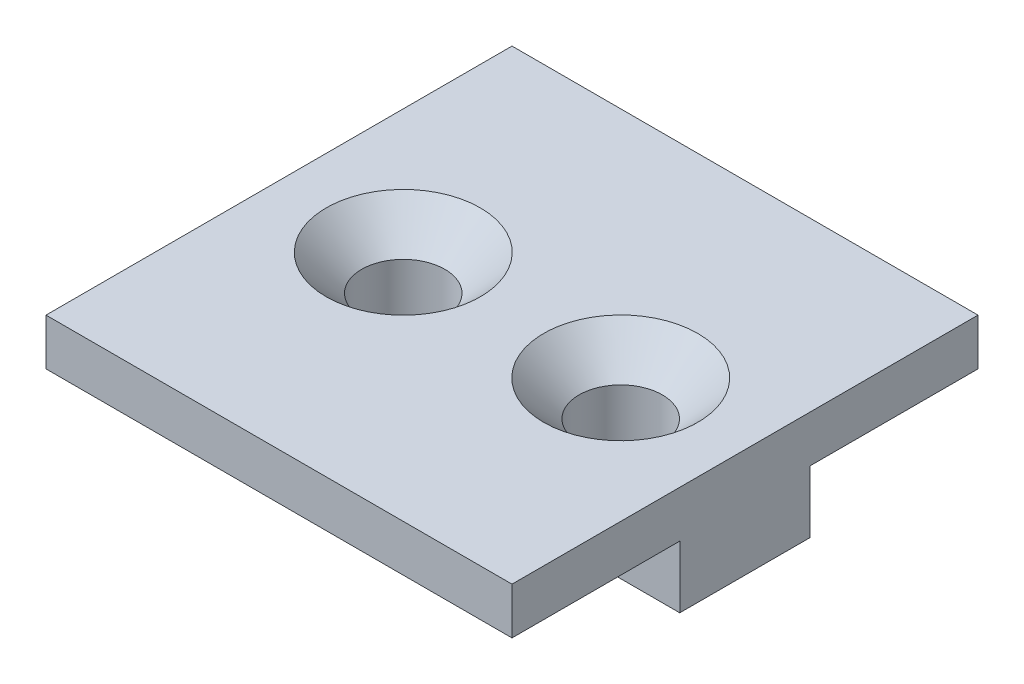
ISO-10303-21;
HEADER;
FILE_DESCRIPTION(('STEP AP214'),'2;1');
FILE_NAME('part.step','',(''),(''),'','','');
FILE_SCHEMA(('AUTOMOTIVE_DESIGN { 1 0 10303 214 1 1 1 1 }'));
ENDSEC;
DATA;
#1=APPLICATION_CONTEXT('core data for automotive mechanical design processes');
#2=APPLICATION_PROTOCOL_DEFINITION('international standard','automotive_design',2000,#1);
#3=PRODUCT_CONTEXT('',#1,'mechanical');
#4=PRODUCT('Part','Part','',(#3));
#5=PRODUCT_RELATED_PRODUCT_CATEGORY('part','',(#4));
#6=PRODUCT_DEFINITION_FORMATION('','',#4);
#7=PRODUCT_DEFINITION_CONTEXT('part definition',#1,'design');
#8=PRODUCT_DEFINITION('design','',#6,#7);
#9=PRODUCT_DEFINITION_SHAPE('','',#8);
#10=(LENGTH_UNIT() NAMED_UNIT(*) SI_UNIT(.MILLI.,.METRE.));
#11=(NAMED_UNIT(*) PLANE_ANGLE_UNIT() SI_UNIT($,.RADIAN.));
#12=(NAMED_UNIT(*) SI_UNIT($,.STERADIAN.) SOLID_ANGLE_UNIT());
#13=UNCERTAINTY_MEASURE_WITH_UNIT(LENGTH_MEASURE(1.E-05),#10,'distance_accuracy_value','');
#14=(GEOMETRIC_REPRESENTATION_CONTEXT(3) GLOBAL_UNCERTAINTY_ASSIGNED_CONTEXT((#13)) GLOBAL_UNIT_ASSIGNED_CONTEXT((#10,
#11,#12)) REPRESENTATION_CONTEXT('',''));
#15=CARTESIAN_POINT('',(0.,0.,0.));
#16=DIRECTION('',(0.,0.,1.));
#17=DIRECTION('',(1.,0.,0.));
#18=AXIS2_PLACEMENT_3D('',#15,#16,#17);
#19=CARTESIAN_POINT('',(-9.525,2.54,-2.667));
#20=DIRECTION('',(1.,0.,0.));
#21=DIRECTION('',(0.,0.,-1.));
#22=AXIS2_PLACEMENT_3D('',#19,#20,#21);
#23=PLANE('',#22);
#24=DIRECTION('',(0.,0.,1.));
#25=VECTOR('',#24,1.);
#26=CARTESIAN_POINT('',(-9.525,0.,-2.667));
#27=LINE('',#26,#25);
#28=CARTESIAN_POINT('',(-9.525,0.,-2.667));
#29=VERTEX_POINT('',#28);
#30=CARTESIAN_POINT('',(-9.525,0.,2.667));
#31=VERTEX_POINT('',#30);
#32=EDGE_CURVE('E132',#29,#31,#27,.T.);
#33=ORIENTED_EDGE('',*,*,#32,.T.);
#34=DIRECTION('',(0.,-1.,0.));
#35=VECTOR('',#34,1.);
#36=CARTESIAN_POINT('',(-9.525,2.54,2.667));
#37=LINE('',#36,#35);
#38=CARTESIAN_POINT('',(-9.525,2.54,2.667));
#39=VERTEX_POINT('',#38);
#40=EDGE_CURVE('E11',#39,#31,#37,.T.);
#41=ORIENTED_EDGE('',*,*,#40,.F.);
#42=DIRECTION('',(0.,0.,1.));
#43=VECTOR('',#42,1.);
#44=CARTESIAN_POINT('',(-9.525,2.54,-9.525));
#45=LINE('',#44,#43);
#46=CARTESIAN_POINT('',(-9.525,2.54,9.525));
#47=VERTEX_POINT('',#46);
#48=EDGE_CURVE('E130',#39,#47,#45,.T.);
#49=ORIENTED_EDGE('',*,*,#48,.T.);
#50=DIRECTION('',(0.,-1.,0.));
#51=VECTOR('',#50,1.);
#52=CARTESIAN_POINT('',(-9.525,4.445,9.525));
#53=LINE('',#52,#51);
#54=CARTESIAN_POINT('',(-9.525,4.445,9.525));
#55=VERTEX_POINT('',#54);
#56=EDGE_CURVE('E111',#55,#47,#53,.T.);
#57=ORIENTED_EDGE('',*,*,#56,.F.);
#58=DIRECTION('',(0.,0.,1.));
#59=VECTOR('',#58,1.);
#60=CARTESIAN_POINT('',(-9.525,4.445,-9.525));
#61=LINE('',#60,#59);
#62=CARTESIAN_POINT('',(-9.525,4.445,-9.525));
#63=VERTEX_POINT('',#62);
#64=EDGE_CURVE('E117',#63,#55,#61,.T.);
#65=ORIENTED_EDGE('',*,*,#64,.F.);
#66=DIRECTION('',(0.,-1.,0.));
#67=VECTOR('',#66,1.);
#68=CARTESIAN_POINT('',(-9.525,4.445,-9.525));
#69=LINE('',#68,#67);
#70=CARTESIAN_POINT('',(-9.525,2.54,-9.525));
#71=VERTEX_POINT('',#70);
#72=EDGE_CURVE('E173',#63,#71,#69,.T.);
#73=ORIENTED_EDGE('',*,*,#72,.T.);
#74=CARTESIAN_POINT('',(-9.525,2.54,-2.667));
#75=VERTEX_POINT('',#74);
#76=EDGE_CURVE('E158',#71,#75,#45,.T.);
#77=ORIENTED_EDGE('',*,*,#76,.T.);
#78=DIRECTION('',(0.,-1.,0.));
#79=VECTOR('',#78,1.);
#80=CARTESIAN_POINT('',(-9.525,2.54,-2.667));
#81=LINE('',#80,#79);
#82=EDGE_CURVE('E143',#75,#29,#81,.T.);
#83=ORIENTED_EDGE('',*,*,#82,.T.);
#84=EDGE_LOOP('',(#33,#41,#49,#57,#65,#73,#77,#83));
#85=FACE_BOUND('',#84,.T.);
#86=ADVANCED_FACE('F36',(#85),#23,.F.);
#87=CARTESIAN_POINT('',(9.525,2.54,2.667));
#88=DIRECTION('',(0.,0.,-1.));
#89=DIRECTION('',(-1.,0.,0.));
#90=AXIS2_PLACEMENT_3D('',#87,#88,#89);
#91=PLANE('',#90);
#92=DIRECTION('',(1.,0.,0.));
#93=VECTOR('',#92,1.);
#94=CARTESIAN_POINT('',(9.525,0.,2.667));
#95=LINE('',#94,#93);
#96=CARTESIAN_POINT('',(9.525,0.,2.667));
#97=VERTEX_POINT('',#96);
#98=EDGE_CURVE('E134',#31,#97,#95,.T.);
#99=ORIENTED_EDGE('',*,*,#98,.T.);
#100=DIRECTION('',(0.,-1.,0.));
#101=VECTOR('',#100,1.);
#102=CARTESIAN_POINT('',(9.525,2.54,2.667));
#103=LINE('',#102,#101);
#104=CARTESIAN_POINT('',(9.525,2.54,2.667));
#105=VERTEX_POINT('',#104);
#106=EDGE_CURVE('E44',#105,#97,#103,.T.);
#107=ORIENTED_EDGE('',*,*,#106,.F.);
#108=DIRECTION('',(1.,0.,0.));
#109=VECTOR('',#108,1.);
#110=CARTESIAN_POINT('',(9.525,2.54,2.667));
#111=LINE('',#110,#109);
#112=EDGE_CURVE('E78',#39,#105,#111,.T.);
#113=ORIENTED_EDGE('',*,*,#112,.F.);
#114=ORIENTED_EDGE('',*,*,#40,.T.);
#115=EDGE_LOOP('',(#99,#107,#113,#114));
#116=FACE_BOUND('',#115,.T.);
#117=ADVANCED_FACE('F223',(#116),#91,.F.);
#118=CARTESIAN_POINT('',(9.525,2.54,-2.667));
#119=DIRECTION('',(-1.,0.,0.));
#120=DIRECTION('',(0.,0.,1.));
#121=AXIS2_PLACEMENT_3D('',#118,#119,#120);
#122=PLANE('',#121);
#123=DIRECTION('',(0.,0.,-1.));
#124=VECTOR('',#123,1.);
#125=CARTESIAN_POINT('',(9.525,0.,-2.667));
#126=LINE('',#125,#124);
#127=CARTESIAN_POINT('',(9.525,0.,-2.667));
#128=VERTEX_POINT('',#127);
#129=EDGE_CURVE('E68',#97,#128,#126,.T.);
#130=ORIENTED_EDGE('',*,*,#129,.T.);
#131=DIRECTION('',(0.,-1.,0.));
#132=VECTOR('',#131,1.);
#133=CARTESIAN_POINT('',(9.525,2.54,-2.667));
#134=LINE('',#133,#132);
#135=CARTESIAN_POINT('',(9.525,2.54,-2.667));
#136=VERTEX_POINT('',#135);
#137=EDGE_CURVE('E52',#136,#128,#134,.T.);
#138=ORIENTED_EDGE('',*,*,#137,.F.);
#139=DIRECTION('',(0.,0.,-1.));
#140=VECTOR('',#139,1.);
#141=CARTESIAN_POINT('',(9.525,2.54,-9.525));
#142=LINE('',#141,#140);
#143=CARTESIAN_POINT('',(9.525,2.54,-9.525));
#144=VERTEX_POINT('',#143);
#145=EDGE_CURVE('E164',#136,#144,#142,.T.);
#146=ORIENTED_EDGE('',*,*,#145,.T.);
#147=DIRECTION('',(0.,-1.,0.));
#148=VECTOR('',#147,1.);
#149=CARTESIAN_POINT('',(9.525,4.445,-9.525));
#150=LINE('',#149,#148);
#151=CARTESIAN_POINT('',(9.525,4.445,-9.525));
#152=VERTEX_POINT('',#151);
#153=EDGE_CURVE('E136',#152,#144,#150,.T.);
#154=ORIENTED_EDGE('',*,*,#153,.F.);
#155=DIRECTION('',(0.,0.,-1.));
#156=VECTOR('',#155,1.);
#157=CARTESIAN_POINT('',(9.525,4.445,-9.525));
#158=LINE('',#157,#156);
#159=CARTESIAN_POINT('',(9.525,4.445,9.525));
#160=VERTEX_POINT('',#159);
#161=EDGE_CURVE('E116',#160,#152,#158,.T.);
#162=ORIENTED_EDGE('',*,*,#161,.F.);
#163=DIRECTION('',(0.,-1.,0.));
#164=VECTOR('',#163,1.);
#165=CARTESIAN_POINT('',(9.525,4.445,9.525));
#166=LINE('',#165,#164);
#167=CARTESIAN_POINT('',(9.525,2.54,9.525));
#168=VERTEX_POINT('',#167);
#169=EDGE_CURVE('E113',#160,#168,#166,.T.);
#170=ORIENTED_EDGE('',*,*,#169,.T.);
#171=EDGE_CURVE('E152',#168,#105,#142,.T.);
#172=ORIENTED_EDGE('',*,*,#171,.T.);
#173=ORIENTED_EDGE('',*,*,#106,.T.);
#174=EDGE_LOOP('',(#130,#138,#146,#154,#162,#170,#172,#173));
#175=FACE_BOUND('',#174,.T.);
#176=ADVANCED_FACE('F150',(#175),#122,.F.);
#177=CARTESIAN_POINT('',(9.525,2.54,-2.667));
#178=DIRECTION('',(0.,0.,1.));
#179=DIRECTION('',(1.,0.,0.));
#180=AXIS2_PLACEMENT_3D('',#177,#178,#179);
#181=PLANE('',#180);
#182=DIRECTION('',(-1.,0.,0.));
#183=VECTOR('',#182,1.);
#184=CARTESIAN_POINT('',(9.525,0.,-2.667));
#185=LINE('',#184,#183);
#186=EDGE_CURVE('E73',#128,#29,#185,.T.);
#187=ORIENTED_EDGE('',*,*,#186,.T.);
#188=ORIENTED_EDGE('',*,*,#82,.F.);
#189=DIRECTION('',(-1.,0.,0.));
#190=VECTOR('',#189,1.);
#191=CARTESIAN_POINT('',(9.525,2.54,-2.667));
#192=LINE('',#191,#190);
#193=EDGE_CURVE('E141',#136,#75,#192,.T.);
#194=ORIENTED_EDGE('',*,*,#193,.F.);
#195=ORIENTED_EDGE('',*,*,#137,.T.);
#196=EDGE_LOOP('',(#187,#188,#194,#195));
#197=FACE_BOUND('',#196,.T.);
#198=ADVANCED_FACE('F159',(#197),#181,.F.);
#199=CARTESIAN_POINT('',(0.,0.,0.));
#200=DIRECTION('',(0.,-1.,0.));
#201=DIRECTION('',(0.,0.,-1.));
#202=AXIS2_PLACEMENT_3D('',#199,#200,#201);
#203=PLANE('',#202);
#204=CARTESIAN_POINT('',(-4.445,0.,0.));
#205=DIRECTION('',(0.,1.,0.));
#206=DIRECTION('',(0.,0.,1.));
#207=AXIS2_PLACEMENT_3D('',#204,#205,#206);
#208=CIRCLE('',#207,1.7);
#209=CARTESIAN_POINT('',(-4.445,0.,1.7));
#210=VERTEX_POINT('',#209);
#211=EDGE_CURVE('E190',#210,#210,#208,.T.);
#212=ORIENTED_EDGE('',*,*,#211,.T.);
#213=EDGE_LOOP('',(#212));
#214=FACE_BOUND('',#213,.T.);
#215=CARTESIAN_POINT('',(4.445,0.,0.));
#216=DIRECTION('',(0.,1.,0.));
#217=DIRECTION('',(0.,0.,1.));
#218=AXIS2_PLACEMENT_3D('',#215,#216,#217);
#219=CIRCLE('',#218,1.7);
#220=CARTESIAN_POINT('',(4.445,0.,1.7));
#221=VERTEX_POINT('',#220);
#222=EDGE_CURVE('E178',#221,#221,#219,.T.);
#223=ORIENTED_EDGE('',*,*,#222,.T.);
#224=EDGE_LOOP('',(#223));
#225=FACE_BOUND('',#224,.T.);
#226=ORIENTED_EDGE('',*,*,#32,.F.);
#227=ORIENTED_EDGE('',*,*,#186,.F.);
#228=ORIENTED_EDGE('',*,*,#129,.F.);
#229=ORIENTED_EDGE('',*,*,#98,.F.);
#230=EDGE_LOOP('',(#226,#227,#228,#229));
#231=FACE_BOUND('',#230,.T.);
#232=ADVANCED_FACE('F155',(#214,#225,#231),#203,.T.);
#233=CARTESIAN_POINT('',(0.,2.54,0.));
#234=DIRECTION('',(0.,-1.,0.));
#235=DIRECTION('',(0.,0.,-1.));
#236=AXIS2_PLACEMENT_3D('',#233,#234,#235);
#237=PLANE('',#236);
#238=ORIENTED_EDGE('',*,*,#48,.F.);
#239=ORIENTED_EDGE('',*,*,#112,.T.);
#240=ORIENTED_EDGE('',*,*,#171,.F.);
#241=DIRECTION('',(1.,0.,0.));
#242=VECTOR('',#241,1.);
#243=CARTESIAN_POINT('',(9.525,2.54,9.525));
#244=LINE('',#243,#242);
#245=EDGE_CURVE('E167',#47,#168,#244,.T.);
#246=ORIENTED_EDGE('',*,*,#245,.F.);
#247=EDGE_LOOP('',(#238,#239,#240,#246));
#248=FACE_BOUND('',#247,.T.);
#249=ADVANCED_FACE('F236',(#248),#237,.T.);
#250=CARTESIAN_POINT('',(9.525,4.445,9.525));
#251=DIRECTION('',(0.,0.,-1.));
#252=DIRECTION('',(-1.,0.,0.));
#253=AXIS2_PLACEMENT_3D('',#250,#251,#252);
#254=PLANE('',#253);
#255=ORIENTED_EDGE('',*,*,#245,.T.);
#256=ORIENTED_EDGE('',*,*,#169,.F.);
#257=DIRECTION('',(1.,0.,0.));
#258=VECTOR('',#257,1.);
#259=CARTESIAN_POINT('',(9.525,4.445,9.525));
#260=LINE('',#259,#258);
#261=EDGE_CURVE('E107',#55,#160,#260,.T.);
#262=ORIENTED_EDGE('',*,*,#261,.F.);
#263=ORIENTED_EDGE('',*,*,#56,.T.);
#264=EDGE_LOOP('',(#255,#256,#262,#263));
#265=FACE_BOUND('',#264,.T.);
#266=ADVANCED_FACE('F109',(#265),#254,.F.);
#267=CARTESIAN_POINT('',(9.525,4.445,-9.525));
#268=DIRECTION('',(0.,0.,1.));
#269=DIRECTION('',(1.,0.,0.));
#270=AXIS2_PLACEMENT_3D('',#267,#268,#269);
#271=PLANE('',#270);
#272=DIRECTION('',(-1.,0.,0.));
#273=VECTOR('',#272,1.);
#274=CARTESIAN_POINT('',(9.525,2.54,-9.525));
#275=LINE('',#274,#273);
#276=EDGE_CURVE('E126',#144,#71,#275,.T.);
#277=ORIENTED_EDGE('',*,*,#276,.T.);
#278=ORIENTED_EDGE('',*,*,#72,.F.);
#279=DIRECTION('',(-1.,0.,0.));
#280=VECTOR('',#279,1.);
#281=CARTESIAN_POINT('',(9.525,4.445,-9.525));
#282=LINE('',#281,#280);
#283=EDGE_CURVE('E122',#152,#63,#282,.T.);
#284=ORIENTED_EDGE('',*,*,#283,.F.);
#285=ORIENTED_EDGE('',*,*,#153,.T.);
#286=EDGE_LOOP('',(#277,#278,#284,#285));
#287=FACE_BOUND('',#286,.T.);
#288=ADVANCED_FACE('F175',(#287),#271,.F.);
#289=CARTESIAN_POINT('',(0.,4.445,0.));
#290=DIRECTION('',(0.,-1.,0.));
#291=DIRECTION('',(0.,0.,-1.));
#292=AXIS2_PLACEMENT_3D('',#289,#290,#291);
#293=PLANE('',#292);
#294=CARTESIAN_POINT('',(-4.445,4.445,0.));
#295=DIRECTION('',(0.,1.,0.));
#296=DIRECTION('',(0.,0.,1.));
#297=AXIS2_PLACEMENT_3D('',#294,#295,#296);
#298=CIRCLE('',#297,3.15);
#299=CARTESIAN_POINT('',(-4.445,4.445,3.15));
#300=VERTEX_POINT('',#299);
#301=EDGE_CURVE('E196',#300,#300,#298,.T.);
#302=ORIENTED_EDGE('',*,*,#301,.F.);
#303=EDGE_LOOP('',(#302));
#304=FACE_BOUND('',#303,.T.);
#305=CARTESIAN_POINT('',(4.445,4.445,0.));
#306=DIRECTION('',(0.,1.,0.));
#307=DIRECTION('',(0.,0.,1.));
#308=AXIS2_PLACEMENT_3D('',#305,#306,#307);
#309=CIRCLE('',#308,3.15);
#310=CARTESIAN_POINT('',(4.445,4.445,3.15));
#311=VERTEX_POINT('',#310);
#312=EDGE_CURVE('E185',#311,#311,#309,.T.);
#313=ORIENTED_EDGE('',*,*,#312,.F.);
#314=EDGE_LOOP('',(#313));
#315=FACE_BOUND('',#314,.T.);
#316=ORIENTED_EDGE('',*,*,#64,.T.);
#317=ORIENTED_EDGE('',*,*,#261,.T.);
#318=ORIENTED_EDGE('',*,*,#161,.T.);
#319=ORIENTED_EDGE('',*,*,#283,.T.);
#320=EDGE_LOOP('',(#316,#317,#318,#319));
#321=FACE_BOUND('',#320,.T.);
#322=ADVANCED_FACE('F120',(#304,#315,#321),#293,.F.);
#323=ORIENTED_EDGE('',*,*,#145,.F.);
#324=ORIENTED_EDGE('',*,*,#193,.T.);
#325=ORIENTED_EDGE('',*,*,#76,.F.);
#326=ORIENTED_EDGE('',*,*,#276,.F.);
#327=EDGE_LOOP('',(#323,#324,#325,#326));
#328=FACE_BOUND('',#327,.T.);
#329=ADVANCED_FACE('F162',(#328),#237,.T.);
#330=CARTESIAN_POINT('',(4.445,4.445,0.));
#331=DIRECTION('',(0.,1.,0.));
#332=DIRECTION('',(0.,0.,1.));
#333=AXIS2_PLACEMENT_3D('',#330,#331,#332);
#334=CYLINDRICAL_SURFACE('',#333,1.7);
#335=ORIENTED_EDGE('',*,*,#222,.F.);
#336=EDGE_LOOP('',(#335));
#337=FACE_BOUND('',#336,.T.);
#338=CARTESIAN_POINT('',(4.445,2.995,0.));
#339=DIRECTION('',(0.,1.,0.));
#340=DIRECTION('',(0.,0.,1.));
#341=AXIS2_PLACEMENT_3D('',#338,#339,#340);
#342=CIRCLE('',#341,1.7);
#343=CARTESIAN_POINT('',(4.445,2.995,1.69999999999999));
#344=VERTEX_POINT('',#343);
#345=EDGE_CURVE('E180',#344,#344,#342,.T.);
#346=ORIENTED_EDGE('',*,*,#345,.T.);
#347=EDGE_LOOP('',(#346));
#348=FACE_BOUND('',#347,.T.);
#349=ADVANCED_FACE('F210',(#337,#348),#334,.F.);
#350=CARTESIAN_POINT('',(4.445,4.445,0.));
#351=DIRECTION('',(0.,1.,0.));
#352=DIRECTION('',(0.,0.,1.));
#353=AXIS2_PLACEMENT_3D('',#350,#351,#352);
#354=CONICAL_SURFACE('',#353,3.15,0.785398163397448);
#355=ORIENTED_EDGE('',*,*,#345,.F.);
#356=EDGE_LOOP('',(#355));
#357=FACE_BOUND('',#356,.T.);
#358=ORIENTED_EDGE('',*,*,#312,.T.);
#359=EDGE_LOOP('',(#358));
#360=FACE_BOUND('',#359,.T.);
#361=ADVANCED_FACE('F207',(#357,#360),#354,.F.);
#362=CARTESIAN_POINT('',(-4.445,4.445,0.));
#363=DIRECTION('',(0.,1.,0.));
#364=DIRECTION('',(0.,0.,1.));
#365=AXIS2_PLACEMENT_3D('',#362,#363,#364);
#366=CYLINDRICAL_SURFACE('',#365,1.7);
#367=ORIENTED_EDGE('',*,*,#211,.F.);
#368=EDGE_LOOP('',(#367));
#369=FACE_BOUND('',#368,.T.);
#370=CARTESIAN_POINT('',(-4.445,2.995,0.));
#371=DIRECTION('',(0.,1.,0.));
#372=DIRECTION('',(0.,0.,1.));
#373=AXIS2_PLACEMENT_3D('',#370,#371,#372);
#374=CIRCLE('',#373,1.7);
#375=CARTESIAN_POINT('',(-4.445,2.995,1.7));
#376=VERTEX_POINT('',#375);
#377=EDGE_CURVE('E193',#376,#376,#374,.T.);
#378=ORIENTED_EDGE('',*,*,#377,.T.);
#379=EDGE_LOOP('',(#378));
#380=FACE_BOUND('',#379,.T.);
#381=ADVANCED_FACE('F209',(#369,#380),#366,.F.);
#382=CARTESIAN_POINT('',(-4.445,4.445,0.));
#383=DIRECTION('',(0.,1.,0.));
#384=DIRECTION('',(0.,0.,1.));
#385=AXIS2_PLACEMENT_3D('',#382,#383,#384);
#386=CONICAL_SURFACE('',#385,3.15,0.785398163397448);
#387=ORIENTED_EDGE('',*,*,#377,.F.);
#388=EDGE_LOOP('',(#387));
#389=FACE_BOUND('',#388,.T.);
#390=ORIENTED_EDGE('',*,*,#301,.T.);
#391=EDGE_LOOP('',(#390));
#392=FACE_BOUND('',#391,.T.);
#393=ADVANCED_FACE('F200',(#389,#392),#386,.F.);
#394=CLOSED_SHELL('',(#86,#117,#176,#198,#232,#249,#266,#288,#322,#329,#349,#361,#381,#393));
#395=MANIFOLD_SOLID_BREP('B2',#394);
#396=ADVANCED_BREP_SHAPE_REPRESENTATION('',(#18,#395),#14);
#397=SHAPE_DEFINITION_REPRESENTATION(#9,#396);
ENDSEC;
END-ISO-10303-21;
